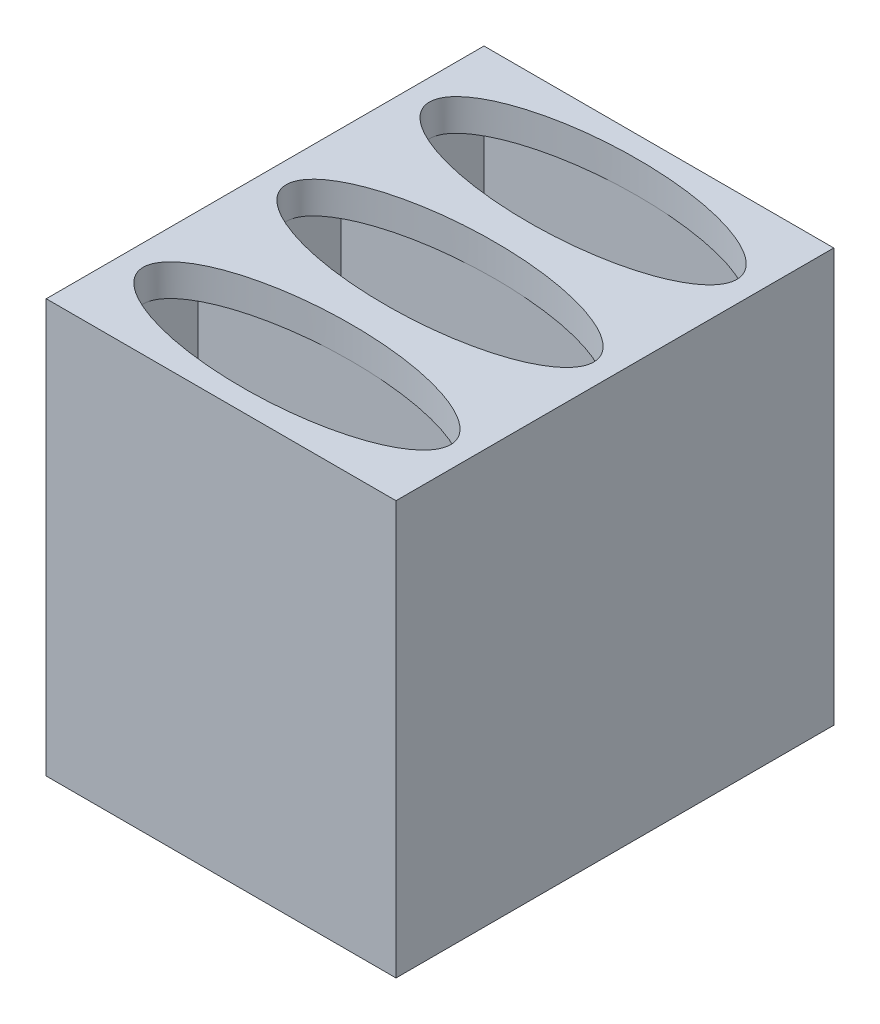
ISO-10303-21;
HEADER;
FILE_DESCRIPTION(('STEP AP214'),'2;1');
FILE_NAME('part.step','',(''),(''),'','','');
FILE_SCHEMA(('AUTOMOTIVE_DESIGN { 1 0 10303 214 1 1 1 1 }'));
ENDSEC;
DATA;
#1=APPLICATION_CONTEXT('core data for automotive mechanical design processes');
#2=APPLICATION_PROTOCOL_DEFINITION('international standard','automotive_design',2000,#1);
#3=PRODUCT_CONTEXT('',#1,'mechanical');
#4=PRODUCT('Part','Part','',(#3));
#5=PRODUCT_RELATED_PRODUCT_CATEGORY('part','',(#4));
#6=PRODUCT_DEFINITION_FORMATION('','',#4);
#7=PRODUCT_DEFINITION_CONTEXT('part definition',#1,'design');
#8=PRODUCT_DEFINITION('design','',#6,#7);
#9=PRODUCT_DEFINITION_SHAPE('','',#8);
#10=(LENGTH_UNIT() NAMED_UNIT(*) SI_UNIT(.MILLI.,.METRE.));
#11=(NAMED_UNIT(*) PLANE_ANGLE_UNIT() SI_UNIT($,.RADIAN.));
#12=(NAMED_UNIT(*) SI_UNIT($,.STERADIAN.) SOLID_ANGLE_UNIT());
#13=UNCERTAINTY_MEASURE_WITH_UNIT(LENGTH_MEASURE(1.E-05),#10,'distance_accuracy_value','');
#14=(GEOMETRIC_REPRESENTATION_CONTEXT(3) GLOBAL_UNCERTAINTY_ASSIGNED_CONTEXT((#13)) GLOBAL_UNIT_ASSIGNED_CONTEXT((#10,
#11,#12)) REPRESENTATION_CONTEXT('',''));
#15=CARTESIAN_POINT('',(0.,0.,0.));
#16=DIRECTION('',(0.,0.,1.));
#17=DIRECTION('',(1.,0.,0.));
#18=AXIS2_PLACEMENT_3D('',#15,#16,#17);
#19=CARTESIAN_POINT('',(0.,0.,0.));
#20=DIRECTION('',(0.,1.,0.));
#21=DIRECTION('',(0.,0.,1.));
#22=AXIS2_PLACEMENT_3D('',#19,#20,#21);
#23=PLANE('',#22);
#24=DIRECTION('',(1.,0.,0.));
#25=VECTOR('',#24,1.);
#26=CARTESIAN_POINT('',(-16.5,0.,34.15));
#27=LINE('',#26,#25);
#28=CARTESIAN_POINT('',(-16.5,0.,34.15));
#29=VERTEX_POINT('',#28);
#30=CARTESIAN_POINT('',(16.5,0.,34.15));
#31=VERTEX_POINT('',#30);
#32=EDGE_CURVE('E204',#29,#31,#27,.T.);
#33=ORIENTED_EDGE('',*,*,#32,.F.);
#34=DIRECTION('',(0.,0.,1.));
#35=VECTOR('',#34,1.);
#36=CARTESIAN_POINT('',(-16.5,0.,7.15));
#37=LINE('',#36,#35);
#38=CARTESIAN_POINT('',(-16.5,0.,-7.15));
#39=VERTEX_POINT('',#38);
#40=EDGE_CURVE('E199',#39,#29,#37,.T.);
#41=ORIENTED_EDGE('',*,*,#40,.F.);
#42=DIRECTION('',(-1.,0.,0.));
#43=VECTOR('',#42,1.);
#44=CARTESIAN_POINT('',(-16.5,0.,-7.15));
#45=LINE('',#44,#43);
#46=CARTESIAN_POINT('',(16.5,0.,-7.15));
#47=VERTEX_POINT('',#46);
#48=EDGE_CURVE('E331',#47,#39,#45,.T.);
#49=ORIENTED_EDGE('',*,*,#48,.F.);
#50=DIRECTION('',(0.,0.,-1.));
#51=VECTOR('',#50,1.);
#52=CARTESIAN_POINT('',(16.5,0.,7.15));
#53=LINE('',#52,#51);
#54=EDGE_CURVE('E329',#31,#47,#53,.T.);
#55=ORIENTED_EDGE('',*,*,#54,.F.);
#56=EDGE_LOOP('',(#33,#41,#49,#55));
#57=FACE_BOUND('',#56,.T.);
#58=DIRECTION('',(0.,0.,-1.));
#59=VECTOR('',#58,1.);
#60=CARTESIAN_POINT('',(14.5,0.,32.15));
#61=LINE('',#60,#59);
#62=CARTESIAN_POINT('',(14.5,0.,32.15));
#63=VERTEX_POINT('',#62);
#64=CARTESIAN_POINT('',(14.5,0.,21.85));
#65=VERTEX_POINT('',#64);
#66=EDGE_CURVE('E693',#63,#65,#61,.T.);
#67=ORIENTED_EDGE('',*,*,#66,.T.);
#68=DIRECTION('',(-1.,0.,0.));
#69=VECTOR('',#68,1.);
#70=CARTESIAN_POINT('',(-14.5,0.,21.85));
#71=LINE('',#70,#69);
#72=CARTESIAN_POINT('',(-14.5,0.,21.85));
#73=VERTEX_POINT('',#72);
#74=EDGE_CURVE('E696',#65,#73,#71,.T.);
#75=ORIENTED_EDGE('',*,*,#74,.T.);
#76=DIRECTION('',(0.,0.,1.));
#77=VECTOR('',#76,1.);
#78=CARTESIAN_POINT('',(-14.5,0.,32.15));
#79=LINE('',#78,#77);
#80=CARTESIAN_POINT('',(-14.5,0.,32.15));
#81=VERTEX_POINT('',#80);
#82=EDGE_CURVE('E681',#73,#81,#79,.T.);
#83=ORIENTED_EDGE('',*,*,#82,.T.);
#84=DIRECTION('',(1.,0.,0.));
#85=VECTOR('',#84,1.);
#86=CARTESIAN_POINT('',(-14.5,0.,32.15));
#87=LINE('',#86,#85);
#88=EDGE_CURVE('E676',#81,#63,#87,.T.);
#89=ORIENTED_EDGE('',*,*,#88,.T.);
#90=EDGE_LOOP('',(#67,#75,#83,#89));
#91=FACE_BOUND('',#90,.T.);
#92=DIRECTION('',(0.,0.,-1.));
#93=VECTOR('',#92,1.);
#94=CARTESIAN_POINT('',(14.5,0.,18.65));
#95=LINE('',#94,#93);
#96=CARTESIAN_POINT('',(14.5,0.,18.65));
#97=VERTEX_POINT('',#96);
#98=CARTESIAN_POINT('',(14.5,0.,8.35));
#99=VERTEX_POINT('',#98);
#100=EDGE_CURVE('E345',#97,#99,#95,.T.);
#101=ORIENTED_EDGE('',*,*,#100,.T.);
#102=DIRECTION('',(-1.,0.,0.));
#103=VECTOR('',#102,1.);
#104=CARTESIAN_POINT('',(-14.5,0.,8.35));
#105=LINE('',#104,#103);
#106=CARTESIAN_POINT('',(-14.5,0.,8.35));
#107=VERTEX_POINT('',#106);
#108=EDGE_CURVE('E362',#99,#107,#105,.T.);
#109=ORIENTED_EDGE('',*,*,#108,.T.);
#110=DIRECTION('',(0.,0.,1.));
#111=VECTOR('',#110,1.);
#112=CARTESIAN_POINT('',(-14.5,0.,18.65));
#113=LINE('',#112,#111);
#114=CARTESIAN_POINT('',(-14.5,0.,18.65));
#115=VERTEX_POINT('',#114);
#116=EDGE_CURVE('E365',#107,#115,#113,.T.);
#117=ORIENTED_EDGE('',*,*,#116,.T.);
#118=DIRECTION('',(1.,0.,0.));
#119=VECTOR('',#118,1.);
#120=CARTESIAN_POINT('',(-14.5,0.,18.65));
#121=LINE('',#120,#119);
#122=EDGE_CURVE('E350',#115,#97,#121,.T.);
#123=ORIENTED_EDGE('',*,*,#122,.T.);
#124=EDGE_LOOP('',(#101,#109,#117,#123));
#125=FACE_BOUND('',#124,.T.);
#126=DIRECTION('',(0.,0.,-1.));
#127=VECTOR('',#126,1.);
#128=CARTESIAN_POINT('',(14.5,0.,5.15));
#129=LINE('',#128,#127);
#130=CARTESIAN_POINT('',(14.5,0.,5.15));
#131=VERTEX_POINT('',#130);
#132=CARTESIAN_POINT('',(14.5,0.,-5.15));
#133=VERTEX_POINT('',#132);
#134=EDGE_CURVE('E193',#131,#133,#129,.T.);
#135=ORIENTED_EDGE('',*,*,#134,.T.);
#136=DIRECTION('',(-1.,0.,0.));
#137=VECTOR('',#136,1.);
#138=CARTESIAN_POINT('',(-14.5,0.,-5.15));
#139=LINE('',#138,#137);
#140=CARTESIAN_POINT('',(-14.5,0.,-5.15));
#141=VERTEX_POINT('',#140);
#142=EDGE_CURVE('E311',#133,#141,#139,.T.);
#143=ORIENTED_EDGE('',*,*,#142,.T.);
#144=DIRECTION('',(0.,0.,1.));
#145=VECTOR('',#144,1.);
#146=CARTESIAN_POINT('',(-14.5,0.,5.15));
#147=LINE('',#146,#145);
#148=CARTESIAN_POINT('',(-14.5,0.,5.15));
#149=VERTEX_POINT('',#148);
#150=EDGE_CURVE('E314',#141,#149,#147,.T.);
#151=ORIENTED_EDGE('',*,*,#150,.T.);
#152=DIRECTION('',(1.,0.,0.));
#153=VECTOR('',#152,1.);
#154=CARTESIAN_POINT('',(-14.5,0.,5.15));
#155=LINE('',#154,#153);
#156=EDGE_CURVE('E317',#149,#131,#155,.T.);
#157=ORIENTED_EDGE('',*,*,#156,.T.);
#158=EDGE_LOOP('',(#135,#143,#151,#157));
#159=FACE_BOUND('',#158,.T.);
#160=ADVANCED_FACE('F33',(#57,#91,#125,#159),#23,.F.);
#161=CARTESIAN_POINT('',(16.5,36.,7.15));
#162=DIRECTION('',(-1.,0.,0.));
#163=DIRECTION('',(0.,0.,1.));
#164=AXIS2_PLACEMENT_3D('',#161,#162,#163);
#165=PLANE('',#164);
#166=DIRECTION('',(0.,0.,-1.));
#167=VECTOR('',#166,1.);
#168=CARTESIAN_POINT('',(16.5,39.,-7.15));
#169=LINE('',#168,#167);
#170=CARTESIAN_POINT('',(16.5,39.,34.15));
#171=VERTEX_POINT('',#170);
#172=CARTESIAN_POINT('',(16.5,39.,-7.15));
#173=VERTEX_POINT('',#172);
#174=EDGE_CURVE('E282',#171,#173,#169,.T.);
#175=ORIENTED_EDGE('',*,*,#174,.F.);
#176=DIRECTION('',(0.,-1.,0.));
#177=VECTOR('',#176,1.);
#178=CARTESIAN_POINT('',(16.5,36.,34.15));
#179=LINE('',#178,#177);
#180=EDGE_CURVE('E203',#171,#31,#179,.T.);
#181=ORIENTED_EDGE('',*,*,#180,.T.);
#182=ORIENTED_EDGE('',*,*,#54,.T.);
#183=DIRECTION('',(0.,-1.,0.));
#184=VECTOR('',#183,1.);
#185=CARTESIAN_POINT('',(16.5,36.,-7.15));
#186=LINE('',#185,#184);
#187=EDGE_CURVE('E11',#173,#47,#186,.T.);
#188=ORIENTED_EDGE('',*,*,#187,.F.);
#189=EDGE_LOOP('',(#175,#181,#182,#188));
#190=FACE_BOUND('',#189,.T.);
#191=ADVANCED_FACE('F35',(#190),#165,.F.);
#192=CARTESIAN_POINT('',(-16.5,36.,-7.15));
#193=DIRECTION('',(0.,0.,1.));
#194=DIRECTION('',(1.,0.,0.));
#195=AXIS2_PLACEMENT_3D('',#192,#193,#194);
#196=PLANE('',#195);
#197=ORIENTED_EDGE('',*,*,#48,.T.);
#198=DIRECTION('',(0.,-1.,0.));
#199=VECTOR('',#198,1.);
#200=CARTESIAN_POINT('',(-16.5,36.,-7.15));
#201=LINE('',#200,#199);
#202=CARTESIAN_POINT('',(-16.5,39.,-7.15));
#203=VERTEX_POINT('',#202);
#204=EDGE_CURVE('E41',#203,#39,#201,.T.);
#205=ORIENTED_EDGE('',*,*,#204,.F.);
#206=DIRECTION('',(-1.,0.,0.));
#207=VECTOR('',#206,1.);
#208=CARTESIAN_POINT('',(16.5,39.,-7.15));
#209=LINE('',#208,#207);
#210=EDGE_CURVE('E190',#173,#203,#209,.T.);
#211=ORIENTED_EDGE('',*,*,#210,.F.);
#212=ORIENTED_EDGE('',*,*,#187,.T.);
#213=EDGE_LOOP('',(#197,#205,#211,#212));
#214=FACE_BOUND('',#213,.T.);
#215=ADVANCED_FACE('F427',(#214),#196,.F.);
#216=CARTESIAN_POINT('',(-16.5,36.,7.15));
#217=DIRECTION('',(1.,0.,0.));
#218=DIRECTION('',(0.,0.,-1.));
#219=AXIS2_PLACEMENT_3D('',#216,#217,#218);
#220=PLANE('',#219);
#221=DIRECTION('',(0.,-1.,0.));
#222=VECTOR('',#221,1.);
#223=CARTESIAN_POINT('',(-16.5,36.,34.15));
#224=LINE('',#223,#222);
#225=CARTESIAN_POINT('',(-16.5,39.,34.15));
#226=VERTEX_POINT('',#225);
#227=EDGE_CURVE('E196',#226,#29,#224,.T.);
#228=ORIENTED_EDGE('',*,*,#227,.F.);
#229=DIRECTION('',(0.,0.,1.));
#230=VECTOR('',#229,1.);
#231=CARTESIAN_POINT('',(-16.5,39.,-7.15));
#232=LINE('',#231,#230);
#233=EDGE_CURVE('E183',#203,#226,#232,.T.);
#234=ORIENTED_EDGE('',*,*,#233,.F.);
#235=ORIENTED_EDGE('',*,*,#204,.T.);
#236=ORIENTED_EDGE('',*,*,#40,.T.);
#237=EDGE_LOOP('',(#228,#234,#235,#236));
#238=FACE_BOUND('',#237,.T.);
#239=ADVANCED_FACE('F197',(#238),#220,.F.);
#240=CARTESIAN_POINT('',(14.5,36.,5.15));
#241=DIRECTION('',(-1.,0.,0.));
#242=DIRECTION('',(0.,0.,1.));
#243=AXIS2_PLACEMENT_3D('',#240,#241,#242);
#244=PLANE('',#243);
#245=ORIENTED_EDGE('',*,*,#134,.F.);
#246=DIRECTION('',(0.,-1.,0.));
#247=VECTOR('',#246,1.);
#248=CARTESIAN_POINT('',(14.5,36.,5.15));
#249=LINE('',#248,#247);
#250=CARTESIAN_POINT('',(14.5,36.,5.15));
#251=VERTEX_POINT('',#250);
#252=EDGE_CURVE('E308',#251,#131,#249,.T.);
#253=ORIENTED_EDGE('',*,*,#252,.F.);
#254=DIRECTION('',(0.,0.,-1.));
#255=VECTOR('',#254,1.);
#256=CARTESIAN_POINT('',(14.5,36.,5.15));
#257=LINE('',#256,#255);
#258=CARTESIAN_POINT('',(14.5,36.,0.));
#259=VERTEX_POINT('',#258);
#260=EDGE_CURVE('E292',#251,#259,#257,.T.);
#261=ORIENTED_EDGE('',*,*,#260,.T.);
#262=CARTESIAN_POINT('',(14.5,36.,-5.15));
#263=VERTEX_POINT('',#262);
#264=EDGE_CURVE('E296',#259,#263,#257,.T.);
#265=ORIENTED_EDGE('',*,*,#264,.T.);
#266=DIRECTION('',(0.,-1.,0.));
#267=VECTOR('',#266,1.);
#268=CARTESIAN_POINT('',(14.5,36.,-5.15));
#269=LINE('',#268,#267);
#270=EDGE_CURVE('E326',#263,#133,#269,.T.);
#271=ORIENTED_EDGE('',*,*,#270,.T.);
#272=EDGE_LOOP('',(#245,#253,#261,#265,#271));
#273=FACE_BOUND('',#272,.T.);
#274=ADVANCED_FACE('F407',(#273),#244,.T.);
#275=CARTESIAN_POINT('',(-14.5,36.,-5.15));
#276=DIRECTION('',(0.,0.,1.));
#277=DIRECTION('',(1.,0.,0.));
#278=AXIS2_PLACEMENT_3D('',#275,#276,#277);
#279=PLANE('',#278);
#280=ORIENTED_EDGE('',*,*,#142,.F.);
#281=ORIENTED_EDGE('',*,*,#270,.F.);
#282=DIRECTION('',(-1.,0.,0.));
#283=VECTOR('',#282,1.);
#284=CARTESIAN_POINT('',(-14.5,36.,-5.15));
#285=LINE('',#284,#283);
#286=CARTESIAN_POINT('',(0.,36.,-5.15));
#287=VERTEX_POINT('',#286);
#288=EDGE_CURVE('E297',#263,#287,#285,.T.);
#289=ORIENTED_EDGE('',*,*,#288,.T.);
#290=CARTESIAN_POINT('',(-14.5,36.,-5.15));
#291=VERTEX_POINT('',#290);
#292=EDGE_CURVE('E295',#287,#291,#285,.T.);
#293=ORIENTED_EDGE('',*,*,#292,.T.);
#294=DIRECTION('',(0.,-1.,0.));
#295=VECTOR('',#294,1.);
#296=CARTESIAN_POINT('',(-14.5,36.,-5.15));
#297=LINE('',#296,#295);
#298=EDGE_CURVE('E324',#291,#141,#297,.T.);
#299=ORIENTED_EDGE('',*,*,#298,.T.);
#300=EDGE_LOOP('',(#280,#281,#289,#293,#299));
#301=FACE_BOUND('',#300,.T.);
#302=ADVANCED_FACE('F401',(#301),#279,.T.);
#303=CARTESIAN_POINT('',(-14.5,36.,5.15));
#304=DIRECTION('',(1.,0.,0.));
#305=DIRECTION('',(0.,0.,-1.));
#306=AXIS2_PLACEMENT_3D('',#303,#304,#305);
#307=PLANE('',#306);
#308=ORIENTED_EDGE('',*,*,#150,.F.);
#309=ORIENTED_EDGE('',*,*,#298,.F.);
#310=DIRECTION('',(0.,0.,1.));
#311=VECTOR('',#310,1.);
#312=CARTESIAN_POINT('',(-14.5,36.,5.15));
#313=LINE('',#312,#311);
#314=CARTESIAN_POINT('',(-14.5,36.,0.));
#315=VERTEX_POINT('',#314);
#316=EDGE_CURVE('E301',#291,#315,#313,.T.);
#317=ORIENTED_EDGE('',*,*,#316,.T.);
#318=CARTESIAN_POINT('',(-14.5,36.,5.15));
#319=VERTEX_POINT('',#318);
#320=EDGE_CURVE('E300',#315,#319,#313,.T.);
#321=ORIENTED_EDGE('',*,*,#320,.T.);
#322=DIRECTION('',(0.,-1.,0.));
#323=VECTOR('',#322,1.);
#324=CARTESIAN_POINT('',(-14.5,36.,5.15));
#325=LINE('',#324,#323);
#326=EDGE_CURVE('E322',#319,#149,#325,.T.);
#327=ORIENTED_EDGE('',*,*,#326,.T.);
#328=EDGE_LOOP('',(#308,#309,#317,#321,#327));
#329=FACE_BOUND('',#328,.T.);
#330=ADVANCED_FACE('F398',(#329),#307,.T.);
#331=CARTESIAN_POINT('',(-14.5,36.,5.15));
#332=DIRECTION('',(0.,0.,-1.));
#333=DIRECTION('',(-1.,0.,0.));
#334=AXIS2_PLACEMENT_3D('',#331,#332,#333);
#335=PLANE('',#334);
#336=ORIENTED_EDGE('',*,*,#156,.F.);
#337=ORIENTED_EDGE('',*,*,#326,.F.);
#338=DIRECTION('',(1.,0.,0.));
#339=VECTOR('',#338,1.);
#340=CARTESIAN_POINT('',(-14.5,36.,5.15));
#341=LINE('',#340,#339);
#342=CARTESIAN_POINT('',(0.,36.,5.15));
#343=VERTEX_POINT('',#342);
#344=EDGE_CURVE('E305',#319,#343,#341,.T.);
#345=ORIENTED_EDGE('',*,*,#344,.T.);
#346=EDGE_CURVE('E304',#343,#251,#341,.T.);
#347=ORIENTED_EDGE('',*,*,#346,.T.);
#348=ORIENTED_EDGE('',*,*,#252,.T.);
#349=EDGE_LOOP('',(#336,#337,#345,#347,#348));
#350=FACE_BOUND('',#349,.T.);
#351=ADVANCED_FACE('F413',(#350),#335,.T.);
#352=CARTESIAN_POINT('',(0.,36.,0.));
#353=DIRECTION('',(0.,-1.,0.));
#354=DIRECTION('',(0.,0.,-1.));
#355=AXIS2_PLACEMENT_3D('',#352,#353,#354);
#356=PLANE('',#355);
#357=ORIENTED_EDGE('',*,*,#260,.F.);
#358=ORIENTED_EDGE('',*,*,#346,.F.);
#359=CARTESIAN_POINT('',(0.,36.,0.));
#360=DIRECTION('',(0.,1.,0.));
#361=DIRECTION('',(1.,0.,0.));
#362=AXIS2_PLACEMENT_3D('',#359,#360,#361);
#363=ELLIPSE('',#362,14.5,5.15);
#364=EDGE_CURVE('E289',#343,#259,#363,.T.);
#365=ORIENTED_EDGE('',*,*,#364,.T.);
#366=EDGE_LOOP('',(#357,#358,#365));
#367=FACE_BOUND('',#366,.T.);
#368=ADVANCED_FACE('F410',(#367),#356,.T.);
#369=ORIENTED_EDGE('',*,*,#264,.F.);
#370=EDGE_CURVE('E283',#259,#287,#363,.T.);
#371=ORIENTED_EDGE('',*,*,#370,.T.);
#372=ORIENTED_EDGE('',*,*,#288,.F.);
#373=EDGE_LOOP('',(#369,#371,#372));
#374=FACE_BOUND('',#373,.T.);
#375=ADVANCED_FACE('F405',(#374),#356,.T.);
#376=ORIENTED_EDGE('',*,*,#292,.F.);
#377=EDGE_CURVE('E288',#287,#315,#363,.T.);
#378=ORIENTED_EDGE('',*,*,#377,.T.);
#379=ORIENTED_EDGE('',*,*,#316,.F.);
#380=EDGE_LOOP('',(#376,#378,#379));
#381=FACE_BOUND('',#380,.T.);
#382=ADVANCED_FACE('F391',(#381),#356,.T.);
#383=ORIENTED_EDGE('',*,*,#344,.F.);
#384=ORIENTED_EDGE('',*,*,#320,.F.);
#385=EDGE_CURVE('E381',#315,#343,#363,.T.);
#386=ORIENTED_EDGE('',*,*,#385,.T.);
#387=EDGE_LOOP('',(#383,#384,#386));
#388=FACE_BOUND('',#387,.T.);
#389=ADVANCED_FACE('F414',(#388),#356,.T.);
#390=CARTESIAN_POINT('',(0.,39.,0.));
#391=DIRECTION('',(0.,-1.,0.));
#392=DIRECTION('',(0.,0.,-1.));
#393=AXIS2_PLACEMENT_3D('',#390,#391,#392);
#394=PLANE('',#393);
#395=ORIENTED_EDGE('',*,*,#174,.T.);
#396=ORIENTED_EDGE('',*,*,#210,.T.);
#397=ORIENTED_EDGE('',*,*,#233,.T.);
#398=DIRECTION('',(1.,0.,0.));
#399=VECTOR('',#398,1.);
#400=CARTESIAN_POINT('',(16.5,39.,34.15));
#401=LINE('',#400,#399);
#402=EDGE_CURVE('E188',#226,#171,#401,.T.);
#403=ORIENTED_EDGE('',*,*,#402,.T.);
#404=EDGE_LOOP('',(#395,#396,#397,#403));
#405=FACE_BOUND('',#404,.T.);
#406=CARTESIAN_POINT('',(0.,39.,0.));
#407=DIRECTION('',(0.,1.,0.));
#408=DIRECTION('',(1.,0.,0.));
#409=AXIS2_PLACEMENT_3D('',#406,#407,#408);
#410=ELLIPSE('',#409,14.5,5.15);
#411=CARTESIAN_POINT('',(14.5,39.,0.));
#412=VERTEX_POINT('',#411);
#413=EDGE_CURVE('E277',#412,#412,#410,.T.);
#414=ORIENTED_EDGE('',*,*,#413,.F.);
#415=EDGE_LOOP('',(#414));
#416=FACE_BOUND('',#415,.T.);
#417=CARTESIAN_POINT('',(0.,39.,27.));
#418=DIRECTION('',(0.,1.,0.));
#419=DIRECTION('',(1.,0.,0.));
#420=AXIS2_PLACEMENT_3D('',#417,#418,#419);
#421=ELLIPSE('',#420,14.5,5.15);
#422=CARTESIAN_POINT('',(14.5,39.,27.));
#423=VERTEX_POINT('',#422);
#424=EDGE_CURVE('E210',#423,#423,#421,.T.);
#425=ORIENTED_EDGE('',*,*,#424,.F.);
#426=EDGE_LOOP('',(#425));
#427=FACE_BOUND('',#426,.T.);
#428=CARTESIAN_POINT('',(0.,39.,13.5));
#429=DIRECTION('',(0.,1.,0.));
#430=DIRECTION('',(1.,0.,0.));
#431=AXIS2_PLACEMENT_3D('',#428,#429,#430);
#432=ELLIPSE('',#431,14.5,5.15);
#433=CARTESIAN_POINT('',(14.5,39.,13.5));
#434=VERTEX_POINT('',#433);
#435=EDGE_CURVE('E220',#434,#434,#432,.T.);
#436=ORIENTED_EDGE('',*,*,#435,.F.);
#437=EDGE_LOOP('',(#436));
#438=FACE_BOUND('',#437,.T.);
#439=ADVANCED_FACE('F185',(#405,#416,#427,#438),#394,.F.);
#440=DIRECTION('',(0.,-1.,0.));
#441=VECTOR('',#440,1.);
#442=SURFACE_OF_LINEAR_EXTRUSION('',#410,#441);
#443=ORIENTED_EDGE('',*,*,#413,.T.);
#444=EDGE_LOOP('',(#443));
#445=FACE_BOUND('',#444,.T.);
#446=ORIENTED_EDGE('',*,*,#370,.F.);
#447=ORIENTED_EDGE('',*,*,#364,.F.);
#448=ORIENTED_EDGE('',*,*,#385,.F.);
#449=ORIENTED_EDGE('',*,*,#377,.F.);
#450=EDGE_LOOP('',(#446,#447,#448,#449));
#451=FACE_BOUND('',#450,.T.);
#452=ADVANCED_FACE('F270',(#445,#451),#442,.T.);
#453=CARTESIAN_POINT('',(14.5,36.,18.65));
#454=DIRECTION('',(-1.,0.,0.));
#455=DIRECTION('',(0.,0.,1.));
#456=AXIS2_PLACEMENT_3D('',#453,#454,#455);
#457=PLANE('',#456);
#458=ORIENTED_EDGE('',*,*,#100,.F.);
#459=DIRECTION('',(0.,-1.,0.));
#460=VECTOR('',#459,1.);
#461=CARTESIAN_POINT('',(14.5,36.,18.65));
#462=LINE('',#461,#460);
#463=CARTESIAN_POINT('',(14.5,36.,18.65));
#464=VERTEX_POINT('',#463);
#465=EDGE_CURVE('E359',#464,#97,#462,.T.);
#466=ORIENTED_EDGE('',*,*,#465,.F.);
#467=DIRECTION('',(0.,0.,-1.));
#468=VECTOR('',#467,1.);
#469=CARTESIAN_POINT('',(14.5,36.,18.65));
#470=LINE('',#469,#468);
#471=CARTESIAN_POINT('',(14.5,36.,13.5));
#472=VERTEX_POINT('',#471);
#473=EDGE_CURVE('E346',#464,#472,#470,.T.);
#474=ORIENTED_EDGE('',*,*,#473,.T.);
#475=DIRECTION('',(0.,0.,1.));
#476=VECTOR('',#475,1.);
#477=CARTESIAN_POINT('',(14.5,36.,18.65));
#478=LINE('',#477,#476);
#479=CARTESIAN_POINT('',(14.5,36.,8.35));
#480=VERTEX_POINT('',#479);
#481=EDGE_CURVE('E718',#480,#472,#478,.T.);
#482=ORIENTED_EDGE('',*,*,#481,.F.);
#483=DIRECTION('',(0.,-1.,0.));
#484=VECTOR('',#483,1.);
#485=CARTESIAN_POINT('',(14.5,36.,8.35));
#486=LINE('',#485,#484);
#487=EDGE_CURVE('E284',#480,#99,#486,.T.);
#488=ORIENTED_EDGE('',*,*,#487,.T.);
#489=EDGE_LOOP('',(#458,#466,#474,#482,#488));
#490=FACE_BOUND('',#489,.T.);
#491=ADVANCED_FACE('F266',(#490),#457,.T.);
#492=CARTESIAN_POINT('',(-14.5,36.,8.35));
#493=DIRECTION('',(0.,0.,1.));
#494=DIRECTION('',(1.,0.,0.));
#495=AXIS2_PLACEMENT_3D('',#492,#493,#494);
#496=PLANE('',#495);
#497=ORIENTED_EDGE('',*,*,#108,.F.);
#498=ORIENTED_EDGE('',*,*,#487,.F.);
#499=DIRECTION('',(-1.,0.,0.));
#500=VECTOR('',#499,1.);
#501=CARTESIAN_POINT('',(-14.5,36.,8.35));
#502=LINE('',#501,#500);
#503=CARTESIAN_POINT('',(0.,36.,8.35));
#504=VERTEX_POINT('',#503);
#505=EDGE_CURVE('E349',#480,#504,#502,.T.);
#506=ORIENTED_EDGE('',*,*,#505,.T.);
#507=DIRECTION('',(1.,0.,0.));
#508=VECTOR('',#507,1.);
#509=CARTESIAN_POINT('',(-14.5,36.,8.35));
#510=LINE('',#509,#508);
#511=CARTESIAN_POINT('',(-14.5,36.,8.35));
#512=VERTEX_POINT('',#511);
#513=EDGE_CURVE('E684',#512,#504,#510,.T.);
#514=ORIENTED_EDGE('',*,*,#513,.F.);
#515=DIRECTION('',(0.,-1.,0.));
#516=VECTOR('',#515,1.);
#517=CARTESIAN_POINT('',(-14.5,36.,8.35));
#518=LINE('',#517,#516);
#519=EDGE_CURVE('E373',#512,#107,#518,.T.);
#520=ORIENTED_EDGE('',*,*,#519,.T.);
#521=EDGE_LOOP('',(#497,#498,#506,#514,#520));
#522=FACE_BOUND('',#521,.T.);
#523=ADVANCED_FACE('F262',(#522),#496,.T.);
#524=CARTESIAN_POINT('',(-14.5,36.,18.65));
#525=DIRECTION('',(1.,0.,0.));
#526=DIRECTION('',(0.,0.,-1.));
#527=AXIS2_PLACEMENT_3D('',#524,#525,#526);
#528=PLANE('',#527);
#529=ORIENTED_EDGE('',*,*,#116,.F.);
#530=ORIENTED_EDGE('',*,*,#519,.F.);
#531=DIRECTION('',(0.,0.,1.));
#532=VECTOR('',#531,1.);
#533=CARTESIAN_POINT('',(-14.5,36.,18.65));
#534=LINE('',#533,#532);
#535=CARTESIAN_POINT('',(-14.5,36.,13.5));
#536=VERTEX_POINT('',#535);
#537=EDGE_CURVE('E353',#512,#536,#534,.T.);
#538=ORIENTED_EDGE('',*,*,#537,.T.);
#539=DIRECTION('',(0.,0.,-1.));
#540=VECTOR('',#539,1.);
#541=CARTESIAN_POINT('',(-14.5,36.,18.65));
#542=LINE('',#541,#540);
#543=CARTESIAN_POINT('',(-14.5,36.,18.65));
#544=VERTEX_POINT('',#543);
#545=EDGE_CURVE('E717',#544,#536,#542,.T.);
#546=ORIENTED_EDGE('',*,*,#545,.F.);
#547=DIRECTION('',(0.,-1.,0.));
#548=VECTOR('',#547,1.);
#549=CARTESIAN_POINT('',(-14.5,36.,18.65));
#550=LINE('',#549,#548);
#551=EDGE_CURVE('E372',#544,#115,#550,.T.);
#552=ORIENTED_EDGE('',*,*,#551,.T.);
#553=EDGE_LOOP('',(#529,#530,#538,#546,#552));
#554=FACE_BOUND('',#553,.T.);
#555=ADVANCED_FACE('F258',(#554),#528,.T.);
#556=CARTESIAN_POINT('',(-14.5,36.,18.65));
#557=DIRECTION('',(0.,0.,-1.));
#558=DIRECTION('',(-1.,0.,0.));
#559=AXIS2_PLACEMENT_3D('',#556,#557,#558);
#560=PLANE('',#559);
#561=ORIENTED_EDGE('',*,*,#122,.F.);
#562=ORIENTED_EDGE('',*,*,#551,.F.);
#563=DIRECTION('',(1.,0.,0.));
#564=VECTOR('',#563,1.);
#565=CARTESIAN_POINT('',(-14.5,36.,18.65));
#566=LINE('',#565,#564);
#567=CARTESIAN_POINT('',(0.,36.,18.65));
#568=VERTEX_POINT('',#567);
#569=EDGE_CURVE('E356',#544,#568,#566,.T.);
#570=ORIENTED_EDGE('',*,*,#569,.T.);
#571=DIRECTION('',(-1.,0.,0.));
#572=VECTOR('',#571,1.);
#573=CARTESIAN_POINT('',(-14.5,36.,18.65));
#574=LINE('',#573,#572);
#575=EDGE_CURVE('E714',#464,#568,#574,.T.);
#576=ORIENTED_EDGE('',*,*,#575,.F.);
#577=ORIENTED_EDGE('',*,*,#465,.T.);
#578=EDGE_LOOP('',(#561,#562,#570,#576,#577));
#579=FACE_BOUND('',#578,.T.);
#580=ADVANCED_FACE('F255',(#579),#560,.T.);
#581=CARTESIAN_POINT('',(-16.5,36.,34.15));
#582=DIRECTION('',(0.,0.,-1.));
#583=DIRECTION('',(-1.,0.,0.));
#584=AXIS2_PLACEMENT_3D('',#581,#582,#583);
#585=PLANE('',#584);
#586=ORIENTED_EDGE('',*,*,#32,.T.);
#587=ORIENTED_EDGE('',*,*,#180,.F.);
#588=ORIENTED_EDGE('',*,*,#402,.F.);
#589=ORIENTED_EDGE('',*,*,#227,.T.);
#590=EDGE_LOOP('',(#586,#587,#588,#589));
#591=FACE_BOUND('',#590,.T.);
#592=ADVANCED_FACE('F207',(#591),#585,.F.);
#593=CARTESIAN_POINT('',(14.5,36.,32.15));
#594=DIRECTION('',(-1.,0.,0.));
#595=DIRECTION('',(0.,0.,1.));
#596=AXIS2_PLACEMENT_3D('',#593,#594,#595);
#597=PLANE('',#596);
#598=ORIENTED_EDGE('',*,*,#66,.F.);
#599=DIRECTION('',(0.,-1.,0.));
#600=VECTOR('',#599,1.);
#601=CARTESIAN_POINT('',(14.5,36.,32.15));
#602=LINE('',#601,#600);
#603=CARTESIAN_POINT('',(14.5,36.,32.15));
#604=VERTEX_POINT('',#603);
#605=EDGE_CURVE('E673',#604,#63,#602,.T.);
#606=ORIENTED_EDGE('',*,*,#605,.F.);
#607=DIRECTION('',(0.,0.,-1.));
#608=VECTOR('',#607,1.);
#609=CARTESIAN_POINT('',(14.5,36.,32.15));
#610=LINE('',#609,#608);
#611=CARTESIAN_POINT('',(14.5,36.,27.));
#612=VERTEX_POINT('',#611);
#613=EDGE_CURVE('E669',#604,#612,#610,.T.);
#614=ORIENTED_EDGE('',*,*,#613,.T.);
#615=DIRECTION('',(0.,0.,1.));
#616=VECTOR('',#615,1.);
#617=CARTESIAN_POINT('',(14.5,36.,32.15));
#618=LINE('',#617,#616);
#619=CARTESIAN_POINT('',(14.5,36.,21.85));
#620=VERTEX_POINT('',#619);
#621=EDGE_CURVE('E670',#620,#612,#618,.T.);
#622=ORIENTED_EDGE('',*,*,#621,.F.);
#623=DIRECTION('',(0.,-1.,0.));
#624=VECTOR('',#623,1.);
#625=CARTESIAN_POINT('',(14.5,36.,21.85));
#626=LINE('',#625,#624);
#627=EDGE_CURVE('E337',#620,#65,#626,.T.);
#628=ORIENTED_EDGE('',*,*,#627,.T.);
#629=EDGE_LOOP('',(#598,#606,#614,#622,#628));
#630=FACE_BOUND('',#629,.T.);
#631=ADVANCED_FACE('F248',(#630),#597,.T.);
#632=CARTESIAN_POINT('',(-14.5,36.,21.85));
#633=DIRECTION('',(0.,0.,1.));
#634=DIRECTION('',(1.,0.,0.));
#635=AXIS2_PLACEMENT_3D('',#632,#633,#634);
#636=PLANE('',#635);
#637=ORIENTED_EDGE('',*,*,#74,.F.);
#638=ORIENTED_EDGE('',*,*,#627,.F.);
#639=DIRECTION('',(-1.,0.,0.));
#640=VECTOR('',#639,1.);
#641=CARTESIAN_POINT('',(-14.5,36.,21.85));
#642=LINE('',#641,#640);
#643=CARTESIAN_POINT('',(0.,36.,21.85));
#644=VERTEX_POINT('',#643);
#645=EDGE_CURVE('E675',#620,#644,#642,.T.);
#646=ORIENTED_EDGE('',*,*,#645,.T.);
#647=DIRECTION('',(1.,0.,0.));
#648=VECTOR('',#647,1.);
#649=CARTESIAN_POINT('',(-14.5,36.,21.85));
#650=LINE('',#649,#648);
#651=CARTESIAN_POINT('',(-14.5,36.,21.85));
#652=VERTEX_POINT('',#651);
#653=EDGE_CURVE('E706',#652,#644,#650,.T.);
#654=ORIENTED_EDGE('',*,*,#653,.F.);
#655=DIRECTION('',(0.,-1.,0.));
#656=VECTOR('',#655,1.);
#657=CARTESIAN_POINT('',(-14.5,36.,21.85));
#658=LINE('',#657,#656);
#659=EDGE_CURVE('E340',#652,#73,#658,.T.);
#660=ORIENTED_EDGE('',*,*,#659,.T.);
#661=EDGE_LOOP('',(#637,#638,#646,#654,#660));
#662=FACE_BOUND('',#661,.T.);
#663=ADVANCED_FACE('F244',(#662),#636,.T.);
#664=CARTESIAN_POINT('',(-14.5,36.,32.15));
#665=DIRECTION('',(1.,0.,0.));
#666=DIRECTION('',(0.,0.,-1.));
#667=AXIS2_PLACEMENT_3D('',#664,#665,#666);
#668=PLANE('',#667);
#669=ORIENTED_EDGE('',*,*,#82,.F.);
#670=ORIENTED_EDGE('',*,*,#659,.F.);
#671=DIRECTION('',(0.,0.,1.));
#672=VECTOR('',#671,1.);
#673=CARTESIAN_POINT('',(-14.5,36.,32.15));
#674=LINE('',#673,#672);
#675=CARTESIAN_POINT('',(-14.5,36.,27.));
#676=VERTEX_POINT('',#675);
#677=EDGE_CURVE('E678',#652,#676,#674,.T.);
#678=ORIENTED_EDGE('',*,*,#677,.T.);
#679=DIRECTION('',(0.,0.,-1.));
#680=VECTOR('',#679,1.);
#681=CARTESIAN_POINT('',(-14.5,36.,32.15));
#682=LINE('',#681,#680);
#683=CARTESIAN_POINT('',(-14.5,36.,32.15));
#684=VERTEX_POINT('',#683);
#685=EDGE_CURVE('E223',#684,#676,#682,.T.);
#686=ORIENTED_EDGE('',*,*,#685,.F.);
#687=DIRECTION('',(0.,-1.,0.));
#688=VECTOR('',#687,1.);
#689=CARTESIAN_POINT('',(-14.5,36.,32.15));
#690=LINE('',#689,#688);
#691=EDGE_CURVE('E702',#684,#81,#690,.T.);
#692=ORIENTED_EDGE('',*,*,#691,.T.);
#693=EDGE_LOOP('',(#669,#670,#678,#686,#692));
#694=FACE_BOUND('',#693,.T.);
#695=ADVANCED_FACE('F240',(#694),#668,.T.);
#696=CARTESIAN_POINT('',(-14.5,36.,32.15));
#697=DIRECTION('',(0.,0.,-1.));
#698=DIRECTION('',(-1.,0.,0.));
#699=AXIS2_PLACEMENT_3D('',#696,#697,#698);
#700=PLANE('',#699);
#701=ORIENTED_EDGE('',*,*,#88,.F.);
#702=ORIENTED_EDGE('',*,*,#691,.F.);
#703=DIRECTION('',(1.,0.,0.));
#704=VECTOR('',#703,1.);
#705=CARTESIAN_POINT('',(-14.5,36.,32.15));
#706=LINE('',#705,#704);
#707=CARTESIAN_POINT('',(0.,36.,32.15));
#708=VERTEX_POINT('',#707);
#709=EDGE_CURVE('E690',#684,#708,#706,.T.);
#710=ORIENTED_EDGE('',*,*,#709,.T.);
#711=EDGE_CURVE('E689',#708,#604,#706,.T.);
#712=ORIENTED_EDGE('',*,*,#711,.T.);
#713=ORIENTED_EDGE('',*,*,#605,.T.);
#714=EDGE_LOOP('',(#701,#702,#710,#712,#713));
#715=FACE_BOUND('',#714,.T.);
#716=ADVANCED_FACE('F237',(#715),#700,.T.);
#717=CARTESIAN_POINT('',(0.,36.,13.5));
#718=DIRECTION('',(0.,-1.,0.));
#719=DIRECTION('',(0.,0.,-1.));
#720=AXIS2_PLACEMENT_3D('',#717,#718,#719);
#721=PLANE('',#720);
#722=ORIENTED_EDGE('',*,*,#537,.F.);
#723=ORIENTED_EDGE('',*,*,#513,.T.);
#724=CARTESIAN_POINT('',(0.,36.,13.5));
#725=DIRECTION('',(0.,1.,0.));
#726=DIRECTION('',(1.,0.,0.));
#727=AXIS2_PLACEMENT_3D('',#724,#725,#726);
#728=ELLIPSE('',#727,14.5,5.15);
#729=EDGE_CURVE('E722',#504,#536,#728,.T.);
#730=ORIENTED_EDGE('',*,*,#729,.T.);
#731=EDGE_LOOP('',(#722,#723,#730));
#732=FACE_BOUND('',#731,.T.);
#733=ADVANCED_FACE('F236',(#732),#721,.T.);
#734=EDGE_CURVE('E214',#472,#504,#728,.T.);
#735=ORIENTED_EDGE('',*,*,#734,.T.);
#736=ORIENTED_EDGE('',*,*,#505,.F.);
#737=ORIENTED_EDGE('',*,*,#481,.T.);
#738=EDGE_LOOP('',(#735,#736,#737));
#739=FACE_BOUND('',#738,.T.);
#740=ADVANCED_FACE('F543',(#739),#721,.T.);
#741=EDGE_CURVE('E209',#568,#472,#728,.T.);
#742=ORIENTED_EDGE('',*,*,#741,.T.);
#743=ORIENTED_EDGE('',*,*,#473,.F.);
#744=ORIENTED_EDGE('',*,*,#575,.T.);
#745=EDGE_LOOP('',(#742,#743,#744));
#746=FACE_BOUND('',#745,.T.);
#747=ADVANCED_FACE('F551',(#746),#721,.T.);
#748=ORIENTED_EDGE('',*,*,#569,.F.);
#749=ORIENTED_EDGE('',*,*,#545,.T.);
#750=EDGE_CURVE('E48',#536,#568,#728,.T.);
#751=ORIENTED_EDGE('',*,*,#750,.T.);
#752=EDGE_LOOP('',(#748,#749,#751));
#753=FACE_BOUND('',#752,.T.);
#754=ADVANCED_FACE('F559',(#753),#721,.T.);
#755=ORIENTED_EDGE('',*,*,#677,.F.);
#756=ORIENTED_EDGE('',*,*,#653,.T.);
#757=CARTESIAN_POINT('',(0.,36.,27.));
#758=DIRECTION('',(0.,1.,0.));
#759=DIRECTION('',(1.,0.,0.));
#760=AXIS2_PLACEMENT_3D('',#757,#758,#759);
#761=ELLIPSE('',#760,14.5,5.15);
#762=EDGE_CURVE('E665',#644,#676,#761,.T.);
#763=ORIENTED_EDGE('',*,*,#762,.T.);
#764=EDGE_LOOP('',(#755,#756,#763));
#765=FACE_BOUND('',#764,.T.);
#766=ADVANCED_FACE('F567',(#765),#721,.T.);
#767=EDGE_CURVE('E216',#612,#644,#761,.T.);
#768=ORIENTED_EDGE('',*,*,#767,.T.);
#769=ORIENTED_EDGE('',*,*,#645,.F.);
#770=ORIENTED_EDGE('',*,*,#621,.T.);
#771=EDGE_LOOP('',(#768,#769,#770));
#772=FACE_BOUND('',#771,.T.);
#773=ADVANCED_FACE('F574',(#772),#721,.T.);
#774=EDGE_CURVE('E662',#708,#612,#761,.T.);
#775=ORIENTED_EDGE('',*,*,#774,.T.);
#776=ORIENTED_EDGE('',*,*,#613,.F.);
#777=ORIENTED_EDGE('',*,*,#711,.F.);
#778=EDGE_LOOP('',(#775,#776,#777));
#779=FACE_BOUND('',#778,.T.);
#780=ADVANCED_FACE('F235',(#779),#721,.T.);
#781=ORIENTED_EDGE('',*,*,#709,.F.);
#782=ORIENTED_EDGE('',*,*,#685,.T.);
#783=EDGE_CURVE('E56',#676,#708,#761,.T.);
#784=ORIENTED_EDGE('',*,*,#783,.T.);
#785=EDGE_LOOP('',(#781,#782,#784));
#786=FACE_BOUND('',#785,.T.);
#787=ADVANCED_FACE('F231',(#786),#721,.T.);
#788=DIRECTION('',(0.,-1.,0.));
#789=VECTOR('',#788,1.);
#790=SURFACE_OF_LINEAR_EXTRUSION('',#432,#789);
#791=ORIENTED_EDGE('',*,*,#435,.T.);
#792=EDGE_LOOP('',(#791));
#793=FACE_BOUND('',#792,.T.);
#794=ORIENTED_EDGE('',*,*,#734,.F.);
#795=ORIENTED_EDGE('',*,*,#741,.F.);
#796=ORIENTED_EDGE('',*,*,#750,.F.);
#797=ORIENTED_EDGE('',*,*,#729,.F.);
#798=EDGE_LOOP('',(#794,#795,#796,#797));
#799=FACE_BOUND('',#798,.T.);
#800=ADVANCED_FACE('F226',(#793,#799),#790,.T.);
#801=DIRECTION('',(0.,-1.,0.));
#802=VECTOR('',#801,1.);
#803=SURFACE_OF_LINEAR_EXTRUSION('',#421,#802);
#804=ORIENTED_EDGE('',*,*,#424,.T.);
#805=EDGE_LOOP('',(#804));
#806=FACE_BOUND('',#805,.T.);
#807=ORIENTED_EDGE('',*,*,#767,.F.);
#808=ORIENTED_EDGE('',*,*,#774,.F.);
#809=ORIENTED_EDGE('',*,*,#783,.F.);
#810=ORIENTED_EDGE('',*,*,#762,.F.);
#811=EDGE_LOOP('',(#807,#808,#809,#810));
#812=FACE_BOUND('',#811,.T.);
#813=ADVANCED_FACE('F230',(#806,#812),#803,.T.);
#814=CLOSED_SHELL('',(#160,#191,#215,#239,#274,#302,#330,#351,#368,#375,#382,#389,#439,#452,
#491,#523,#555,#580,#592,#631,#663,#695,#716,#733,#740,#747,#754,#766,#773,#780,#787,#800,#813));
#815=MANIFOLD_SOLID_BREP('B2',#814);
#816=ADVANCED_BREP_SHAPE_REPRESENTATION('',(#18,#815),#14);
#817=SHAPE_DEFINITION_REPRESENTATION(#9,#816);
ENDSEC;
END-ISO-10303-21;
